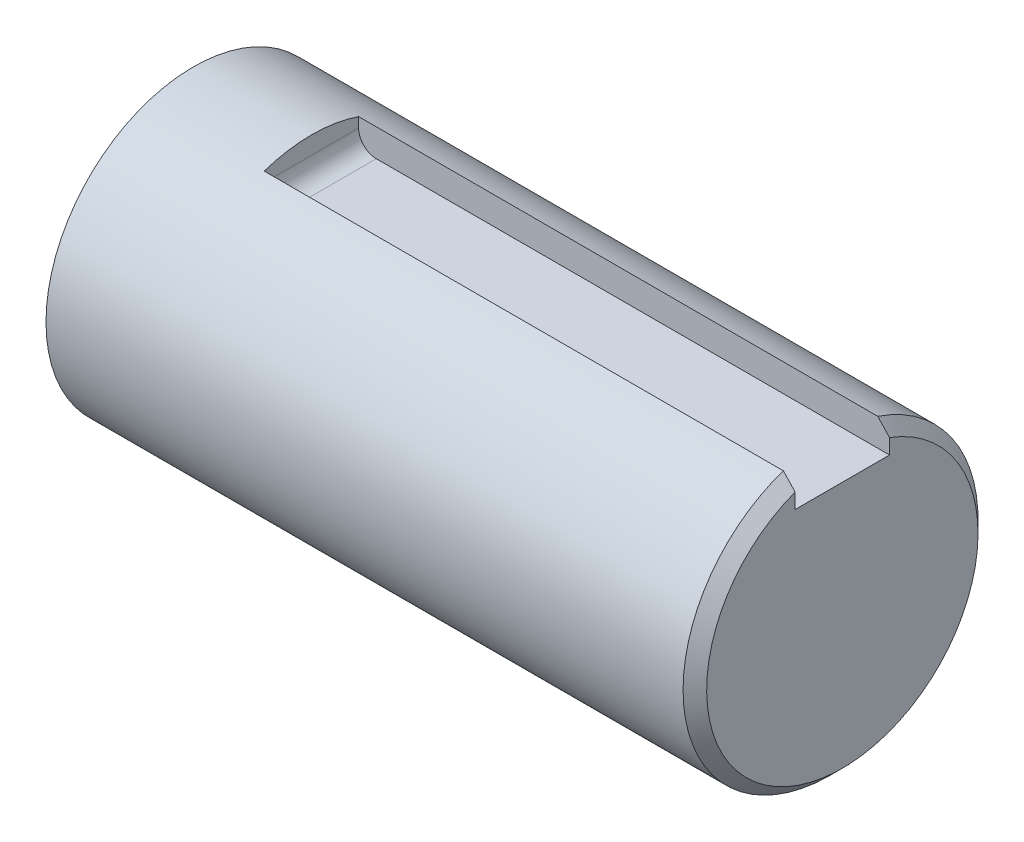
ISO-10303-21;
HEADER;
FILE_DESCRIPTION(('STEP AP214'),'2;1');
FILE_NAME('part.step','',(''),(''),'','','');
FILE_SCHEMA(('AUTOMOTIVE_DESIGN { 1 0 10303 214 1 1 1 1 }'));
ENDSEC;
DATA;
#1=APPLICATION_CONTEXT('core data for automotive mechanical design processes');
#2=APPLICATION_PROTOCOL_DEFINITION('international standard','automotive_design',2000,#1);
#3=PRODUCT_CONTEXT('',#1,'mechanical');
#4=PRODUCT('Part','Part','',(#3));
#5=PRODUCT_RELATED_PRODUCT_CATEGORY('part','',(#4));
#6=PRODUCT_DEFINITION_FORMATION('','',#4);
#7=PRODUCT_DEFINITION_CONTEXT('part definition',#1,'design');
#8=PRODUCT_DEFINITION('design','',#6,#7);
#9=PRODUCT_DEFINITION_SHAPE('','',#8);
#10=(LENGTH_UNIT() NAMED_UNIT(*) SI_UNIT(.MILLI.,.METRE.));
#11=(NAMED_UNIT(*) PLANE_ANGLE_UNIT() SI_UNIT($,.RADIAN.));
#12=(NAMED_UNIT(*) SI_UNIT($,.STERADIAN.) SOLID_ANGLE_UNIT());
#13=UNCERTAINTY_MEASURE_WITH_UNIT(LENGTH_MEASURE(1.E-05),#10,'distance_accuracy_value','');
#14=(GEOMETRIC_REPRESENTATION_CONTEXT(3) GLOBAL_UNCERTAINTY_ASSIGNED_CONTEXT((#13)) GLOBAL_UNIT_ASSIGNED_CONTEXT((#10,
#11,#12)) REPRESENTATION_CONTEXT('',''));
#15=CARTESIAN_POINT('',(0.,0.,0.));
#16=DIRECTION('',(0.,0.,1.));
#17=DIRECTION('',(1.,0.,0.));
#18=AXIS2_PLACEMENT_3D('',#15,#16,#17);
#19=CARTESIAN_POINT('',(-55.,25.,0.));
#20=DIRECTION('',(1.,0.,0.));
#21=DIRECTION('',(0.,0.,-1.));
#22=AXIS2_PLACEMENT_3D('',#19,#20,#21);
#23=PLANE('',#22);
#24=CARTESIAN_POINT('',(-55.,0.,0.));
#25=DIRECTION('',(-1.,0.,0.));
#26=DIRECTION('',(0.,0.,1.));
#27=AXIS2_PLACEMENT_3D('',#24,#25,#26);
#28=CIRCLE('',#27,25.);
#29=CARTESIAN_POINT('',(-55.,0.,25.));
#30=VERTEX_POINT('',#29);
#31=EDGE_CURVE('E129',#30,#30,#28,.T.);
#32=ORIENTED_EDGE('',*,*,#31,.T.);
#33=EDGE_LOOP('',(#32));
#34=FACE_BOUND('',#33,.T.);
#35=ADVANCED_FACE('F47',(#34),#23,.F.);
#36=CARTESIAN_POINT('',(55.,25.,0.));
#37=DIRECTION('',(-1.,0.,0.));
#38=DIRECTION('',(0.,0.,1.));
#39=AXIS2_PLACEMENT_3D('',#36,#37,#38);
#40=PLANE('',#39);
#41=DIRECTION('',(0.,-1.,0.));
#42=VECTOR('',#41,1.);
#43=CARTESIAN_POINT('',(55.,30.8690172302351,8.));
#44=LINE('',#43,#42);
#45=CARTESIAN_POINT('',(55.,21.5638586528478,8.));
#46=VERTEX_POINT('',#45);
#47=CARTESIAN_POINT('',(55.,19.,8.));
#48=VERTEX_POINT('',#47);
#49=EDGE_CURVE('E110',#46,#48,#44,.T.);
#50=ORIENTED_EDGE('',*,*,#49,.F.);
#51=CARTESIAN_POINT('',(55.,0.,0.));
#52=DIRECTION('',(-1.,0.,0.));
#53=DIRECTION('',(0.,0.,1.));
#54=AXIS2_PLACEMENT_3D('',#51,#52,#53);
#55=CIRCLE('',#54,23.);
#56=CARTESIAN_POINT('',(55.,21.5638586528478,-8.));
#57=VERTEX_POINT('',#56);
#58=EDGE_CURVE('E156',#46,#57,#55,.F.);
#59=ORIENTED_EDGE('',*,*,#58,.T.);
#60=DIRECTION('',(0.,1.,0.));
#61=VECTOR('',#60,1.);
#62=CARTESIAN_POINT('',(55.,19.,-8.));
#63=LINE('',#62,#61);
#64=CARTESIAN_POINT('',(55.,19.,-8.));
#65=VERTEX_POINT('',#64);
#66=EDGE_CURVE('E120',#65,#57,#63,.T.);
#67=ORIENTED_EDGE('',*,*,#66,.F.);
#68=DIRECTION('',(0.,0.,-1.));
#69=VECTOR('',#68,1.);
#70=CARTESIAN_POINT('',(55.,19.,8.));
#71=LINE('',#70,#69);
#72=EDGE_CURVE('E101',#48,#65,#71,.T.);
#73=ORIENTED_EDGE('',*,*,#72,.F.);
#74=EDGE_LOOP('',(#50,#59,#67,#73));
#75=FACE_BOUND('',#74,.T.);
#76=ADVANCED_FACE('F118',(#75),#40,.F.);
#77=CARTESIAN_POINT('',(-55.,0.,0.));
#78=DIRECTION('',(-1.,0.,0.));
#79=DIRECTION('',(0.,0.,1.));
#80=AXIS2_PLACEMENT_3D('',#77,#78,#79);
#81=CYLINDRICAL_SURFACE('',#80,25.);
#82=ORIENTED_EDGE('',*,*,#31,.F.);
#83=EDGE_LOOP('',(#82));
#84=FACE_BOUND('',#83,.T.);
#85=DIRECTION('',(-1.,0.,0.));
#86=VECTOR('',#85,1.);
#87=CARTESIAN_POINT('',(-55.,23.685438564654,-8.));
#88=LINE('',#87,#86);
#89=CARTESIAN_POINT('',(-35.,23.685438564654,-8.));
#90=VERTEX_POINT('',#89);
#91=CARTESIAN_POINT('',(53.,23.685438564654,-8.));
#92=VERTEX_POINT('',#91);
#93=EDGE_CURVE('E141',#90,#92,#88,.F.);
#94=ORIENTED_EDGE('',*,*,#93,.T.);
#95=CARTESIAN_POINT('',(53.,0.,0.));
#96=DIRECTION('',(-1.,0.,0.));
#97=DIRECTION('',(0.,0.,1.));
#98=AXIS2_PLACEMENT_3D('',#95,#96,#97);
#99=CIRCLE('',#98,25.);
#100=CARTESIAN_POINT('',(53.,23.685438564654,8.));
#101=VERTEX_POINT('',#100);
#102=EDGE_CURVE('E145',#92,#101,#99,.T.);
#103=ORIENTED_EDGE('',*,*,#102,.T.);
#104=DIRECTION('',(-1.,0.,0.));
#105=VECTOR('',#104,1.);
#106=CARTESIAN_POINT('',(-55.,23.685438564654,8.));
#107=LINE('',#106,#105);
#108=CARTESIAN_POINT('',(-35.,23.685438564654,8.));
#109=VERTEX_POINT('',#108);
#110=EDGE_CURVE('E138',#101,#109,#107,.T.);
#111=ORIENTED_EDGE('',*,*,#110,.T.);
#112=CARTESIAN_POINT('',(-35.,0.,0.));
#113=DIRECTION('',(1.,0.,0.));
#114=DIRECTION('',(0.,0.,-1.));
#115=AXIS2_PLACEMENT_3D('',#112,#113,#114);
#116=CIRCLE('',#115,25.);
#117=EDGE_CURVE('E134',#90,#109,#116,.T.);
#118=ORIENTED_EDGE('',*,*,#117,.F.);
#119=EDGE_LOOP('',(#94,#103,#111,#118));
#120=FACE_BOUND('',#119,.T.);
#121=ADVANCED_FACE('F169',(#84,#120),#81,.T.);
#122=CARTESIAN_POINT('',(-35.,19.,-8.));
#123=DIRECTION('',(0.,0.,-1.));
#124=DIRECTION('',(-1.,0.,0.));
#125=AXIS2_PLACEMENT_3D('',#122,#123,#124);
#126=PLANE('',#125);
#127=DIRECTION('',(0.,1.,0.));
#128=VECTOR('',#127,1.);
#129=CARTESIAN_POINT('',(-35.,19.,-8.));
#130=LINE('',#129,#128);
#131=CARTESIAN_POINT('',(-35.,22.,-8.));
#132=VERTEX_POINT('',#131);
#133=EDGE_CURVE('E107',#132,#90,#130,.T.);
#134=ORIENTED_EDGE('',*,*,#133,.F.);
#135=CARTESIAN_POINT('',(-32.,22.,-8.));
#136=DIRECTION('',(0.,0.,-1.));
#137=DIRECTION('',(-1.,0.,0.));
#138=AXIS2_PLACEMENT_3D('',#135,#136,#137);
#139=CIRCLE('',#138,3.);
#140=CARTESIAN_POINT('',(-32.,19.,-8.));
#141=VERTEX_POINT('',#140);
#142=EDGE_CURVE('E70',#132,#141,#139,.F.);
#143=ORIENTED_EDGE('',*,*,#142,.T.);
#144=DIRECTION('',(1.,0.,0.));
#145=VECTOR('',#144,1.);
#146=CARTESIAN_POINT('',(-35.,19.,-8.));
#147=LINE('',#146,#145);
#148=EDGE_CURVE('E106',#141,#65,#147,.T.);
#149=ORIENTED_EDGE('',*,*,#148,.T.);
#150=ORIENTED_EDGE('',*,*,#66,.T.);
#151=CARTESIAN_POINT('',(55.,21.5638586528478,-8.));
#152=CARTESIAN_POINT('',(54.8338152212341,21.7411107364013,-8.));
#153=CARTESIAN_POINT('',(54.6674990503642,21.9182395858735,-8.));
#154=CARTESIAN_POINT('',(54.3346207902283,22.2722654969859,-8.));
#155=CARTESIAN_POINT('',(54.1680587013803,22.4491625590192,-8.));
#156=CARTESIAN_POINT('',(53.8347049394336,22.8027401426304,-8.));
#157=CARTESIAN_POINT('',(53.6679132663803,22.9794206642512,-8.));
#158=CARTESIAN_POINT('',(53.3341145040076,23.332578673005,-8.));
#159=CARTESIAN_POINT('',(53.1671074143229,23.5090561597927,-8.));
#160=CARTESIAN_POINT('',(53.,23.685438564654,-8.));
#161=B_SPLINE_CURVE_WITH_KNOTS('',3,(#151,#152,#153,#154,#155,#156,#157,#158,#159,#160),
.UNSPECIFIED.,.F.,.F.,(4,2,2,2,4),(0.,0.728917669389527,1.45783410081457,2.18675038823146,
2.91566791341975),.UNSPECIFIED.);
#162=EDGE_CURVE('E185',#57,#92,#161,.T.);
#163=ORIENTED_EDGE('',*,*,#162,.T.);
#164=ORIENTED_EDGE('',*,*,#93,.F.);
#165=EDGE_LOOP('',(#134,#143,#149,#150,#163,#164));
#166=FACE_BOUND('',#165,.T.);
#167=ADVANCED_FACE('F167',(#166),#126,.F.);
#168=CARTESIAN_POINT('',(-35.,30.8690172302351,8.));
#169=DIRECTION('',(0.,0.,1.));
#170=DIRECTION('',(1.,0.,0.));
#171=AXIS2_PLACEMENT_3D('',#168,#169,#170);
#172=PLANE('',#171);
#173=DIRECTION('',(1.,0.,0.));
#174=VECTOR('',#173,1.);
#175=CARTESIAN_POINT('',(-35.,19.,8.));
#176=LINE('',#175,#174);
#177=CARTESIAN_POINT('',(-32.,19.,8.));
#178=VERTEX_POINT('',#177);
#179=EDGE_CURVE('E97',#178,#48,#176,.T.);
#180=ORIENTED_EDGE('',*,*,#179,.F.);
#181=CARTESIAN_POINT('',(-32.,22.,8.));
#182=DIRECTION('',(0.,0.,1.));
#183=DIRECTION('',(1.,0.,0.));
#184=AXIS2_PLACEMENT_3D('',#181,#182,#183);
#185=CIRCLE('',#184,3.);
#186=CARTESIAN_POINT('',(-35.,22.,8.));
#187=VERTEX_POINT('',#186);
#188=EDGE_CURVE('E11',#178,#187,#185,.F.);
#189=ORIENTED_EDGE('',*,*,#188,.T.);
#190=DIRECTION('',(0.,-1.,0.));
#191=VECTOR('',#190,1.);
#192=CARTESIAN_POINT('',(-35.,30.8690172302351,8.));
#193=LINE('',#192,#191);
#194=EDGE_CURVE('E124',#109,#187,#193,.T.);
#195=ORIENTED_EDGE('',*,*,#194,.F.);
#196=ORIENTED_EDGE('',*,*,#110,.F.);
#197=CARTESIAN_POINT('',(53.,23.685438564654,8.));
#198=CARTESIAN_POINT('',(53.1671074143229,23.5090561597927,8.));
#199=CARTESIAN_POINT('',(53.3341145040076,23.332578673005,8.));
#200=CARTESIAN_POINT('',(53.6679132663803,22.9794206642512,8.));
#201=CARTESIAN_POINT('',(53.8347049394336,22.8027401426304,8.));
#202=CARTESIAN_POINT('',(54.1680587013803,22.4491625590192,8.));
#203=CARTESIAN_POINT('',(54.3346207902283,22.2722654969859,8.));
#204=CARTESIAN_POINT('',(54.6674990503642,21.9182395858735,8.));
#205=CARTESIAN_POINT('',(54.8338152212341,21.7411107364013,8.));
#206=CARTESIAN_POINT('',(55.,21.5638586528478,8.));
#207=B_SPLINE_CURVE_WITH_KNOTS('',3,(#197,#198,#199,#200,#201,#202,#203,#204,#205,#206),
.UNSPECIFIED.,.F.,.F.,(4,2,2,2,4),(0.,0.728917525188292,1.45783381260518,2.18675024403022,
2.91566791341975),.UNSPECIFIED.);
#208=EDGE_CURVE('E113',#101,#46,#207,.T.);
#209=ORIENTED_EDGE('',*,*,#208,.T.);
#210=ORIENTED_EDGE('',*,*,#49,.T.);
#211=EDGE_LOOP('',(#180,#189,#195,#196,#209,#210));
#212=FACE_BOUND('',#211,.T.);
#213=ADVANCED_FACE('F111',(#212),#172,.F.);
#214=CARTESIAN_POINT('',(-35.,0.,0.));
#215=DIRECTION('',(1.,0.,0.));
#216=DIRECTION('',(0.,0.,-1.));
#217=AXIS2_PLACEMENT_3D('',#214,#215,#216);
#218=PLANE('',#217);
#219=ORIENTED_EDGE('',*,*,#194,.T.);
#220=DIRECTION('',(0.,0.,-1.));
#221=VECTOR('',#220,1.);
#222=CARTESIAN_POINT('',(-35.,22.,0.));
#223=LINE('',#222,#221);
#224=EDGE_CURVE('E188',#187,#132,#223,.T.);
#225=ORIENTED_EDGE('',*,*,#224,.T.);
#226=ORIENTED_EDGE('',*,*,#133,.T.);
#227=ORIENTED_EDGE('',*,*,#117,.T.);
#228=EDGE_LOOP('',(#219,#225,#226,#227));
#229=FACE_BOUND('',#228,.T.);
#230=ADVANCED_FACE('F166',(#229),#218,.T.);
#231=CARTESIAN_POINT('',(-35.,19.,8.));
#232=DIRECTION('',(0.,-1.,0.));
#233=DIRECTION('',(0.,0.,-1.));
#234=AXIS2_PLACEMENT_3D('',#231,#232,#233);
#235=PLANE('',#234);
#236=ORIENTED_EDGE('',*,*,#148,.F.);
#237=DIRECTION('',(0.,0.,-1.));
#238=VECTOR('',#237,1.);
#239=CARTESIAN_POINT('',(-32.,19.,8.));
#240=LINE('',#239,#238);
#241=EDGE_CURVE('E56',#141,#178,#240,.F.);
#242=ORIENTED_EDGE('',*,*,#241,.T.);
#243=ORIENTED_EDGE('',*,*,#179,.T.);
#244=ORIENTED_EDGE('',*,*,#72,.T.);
#245=EDGE_LOOP('',(#236,#242,#243,#244));
#246=FACE_BOUND('',#245,.T.);
#247=ADVANCED_FACE('F99',(#246),#235,.F.);
#248=CARTESIAN_POINT('',(53.,0.,0.));
#249=DIRECTION('',(-1.,0.,0.));
#250=DIRECTION('',(0.,0.,1.));
#251=AXIS2_PLACEMENT_3D('',#248,#249,#250);
#252=CONICAL_SURFACE('',#251,25.,0.785398163397454);
#253=ORIENTED_EDGE('',*,*,#162,.F.);
#254=ORIENTED_EDGE('',*,*,#58,.F.);
#255=ORIENTED_EDGE('',*,*,#208,.F.);
#256=ORIENTED_EDGE('',*,*,#102,.F.);
#257=EDGE_LOOP('',(#253,#254,#255,#256));
#258=FACE_BOUND('',#257,.T.);
#259=ADVANCED_FACE('F159',(#258),#252,.T.);
#260=CARTESIAN_POINT('',(-32.,22.,0.));
#261=DIRECTION('',(0.,0.,-1.));
#262=DIRECTION('',(-1.,0.,0.));
#263=AXIS2_PLACEMENT_3D('',#260,#261,#262);
#264=CYLINDRICAL_SURFACE('',#263,3.);
#265=ORIENTED_EDGE('',*,*,#188,.F.);
#266=ORIENTED_EDGE('',*,*,#241,.F.);
#267=ORIENTED_EDGE('',*,*,#142,.F.);
#268=ORIENTED_EDGE('',*,*,#224,.F.);
#269=EDGE_LOOP('',(#265,#266,#267,#268));
#270=FACE_BOUND('',#269,.T.);
#271=ADVANCED_FACE('F49',(#270),#264,.F.);
#272=CLOSED_SHELL('',(#35,#76,#121,#167,#213,#230,#247,#259,#271));
#273=MANIFOLD_SOLID_BREP('B2',#272);
#274=ADVANCED_BREP_SHAPE_REPRESENTATION('',(#18,#273),#14);
#275=SHAPE_DEFINITION_REPRESENTATION(#9,#274);
ENDSEC;
END-ISO-10303-21;
